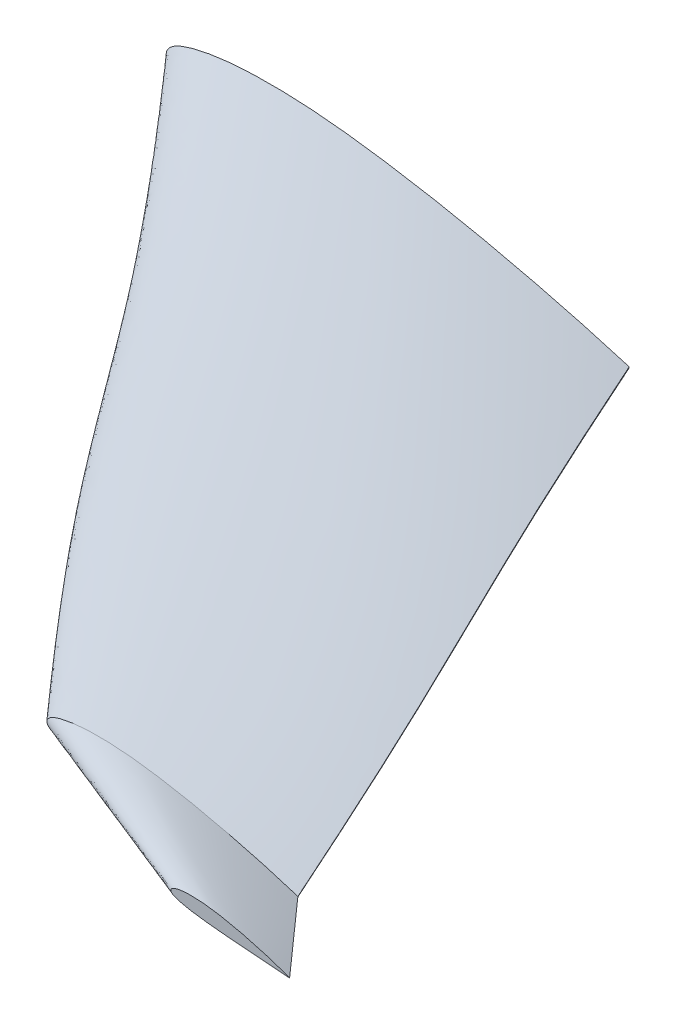
ISO-10303-21;
HEADER;
FILE_DESCRIPTION(('STEP AP214'),'2;1');
FILE_NAME('part.step','',(''),(''),'','','');
FILE_SCHEMA(('AUTOMOTIVE_DESIGN { 1 0 10303 214 1 1 1 1 }'));
ENDSEC;
DATA;
#1=APPLICATION_CONTEXT('core data for automotive mechanical design processes');
#2=APPLICATION_PROTOCOL_DEFINITION('international standard','automotive_design',2000,#1);
#3=PRODUCT_CONTEXT('',#1,'mechanical');
#4=PRODUCT('Part','Part','',(#3));
#5=PRODUCT_RELATED_PRODUCT_CATEGORY('part','',(#4));
#6=PRODUCT_DEFINITION_FORMATION('','',#4);
#7=PRODUCT_DEFINITION_CONTEXT('part definition',#1,'design');
#8=PRODUCT_DEFINITION('design','',#6,#7);
#9=PRODUCT_DEFINITION_SHAPE('','',#8);
#10=(LENGTH_UNIT() NAMED_UNIT(*) SI_UNIT(.MILLI.,.METRE.));
#11=(NAMED_UNIT(*) PLANE_ANGLE_UNIT() SI_UNIT($,.RADIAN.));
#12=(NAMED_UNIT(*) SI_UNIT($,.STERADIAN.) SOLID_ANGLE_UNIT());
#13=UNCERTAINTY_MEASURE_WITH_UNIT(LENGTH_MEASURE(1.E-05),#10,'distance_accuracy_value','');
#14=(GEOMETRIC_REPRESENTATION_CONTEXT(3) GLOBAL_UNCERTAINTY_ASSIGNED_CONTEXT((#13)) GLOBAL_UNIT_ASSIGNED_CONTEXT((#10,
#11,#12)) REPRESENTATION_CONTEXT('',''));
#15=CARTESIAN_POINT('',(0.,0.,0.));
#16=DIRECTION('',(0.,0.,1.));
#17=DIRECTION('',(1.,0.,0.));
#18=AXIS2_PLACEMENT_3D('',#15,#16,#17);
#19=CARTESIAN_POINT('',(0.321211549588751,1.38513605000242,0.));
#20=DIRECTION('',(0.,0.,-1.));
#21=DIRECTION('',(-1.,0.,0.));
#22=AXIS2_PLACEMENT_3D('',#19,#20,#21);
#23=PLANE('',#22);
#24=CARTESIAN_POINT('',(213.493162135836,-18.3985977387796,0.));
#25=CARTESIAN_POINT('',(210.001068508854,-17.358861418454,0.));
#26=CARTESIAN_POINT('',(203.02605295468,-15.2821195606542,0.));
#27=CARTESIAN_POINT('',(189.042387614006,-11.3725974573167,0.));
#28=CARTESIAN_POINT('',(171.520112606889,-6.86338505017849,0.));
#29=CARTESIAN_POINT('',(150.436618758431,-1.93851155160731,0.));
#30=CARTESIAN_POINT('',(129.312241209844,2.47849407440199,0.));
#31=CARTESIAN_POINT('',(108.118882190536,6.21363198308793,0.));
#32=CARTESIAN_POINT('',(86.8776689668776,9.34577660300751,0.));
#33=CARTESIAN_POINT('',(69.0819293463606,11.1183147996094,0.));
#34=CARTESIAN_POINT('',(54.792834861414,11.7745190823262,0.));
#35=CARTESIAN_POINT('',(44.03039723417,11.8458319915289,0.));
#36=CARTESIAN_POINT('',(33.2103727065102,11.4143190106629,0.));
#37=CARTESIAN_POINT('',(24.1576584095502,10.5092531024174,0.));
#38=CARTESIAN_POINT('',(16.891423222456,9.22497315586533,0.));
#39=CARTESIAN_POINT('',(11.3574177018554,7.96357807401569,0.));
#40=CARTESIAN_POINT('',(6.62056207418062,6.34416223062721,0.));
#41=CARTESIAN_POINT('',(2.47282370966279,4.24123989482026,0.));
#42=CARTESIAN_POINT('',(-1.32769035633093,0.309486082961757,0.));
#43=CARTESIAN_POINT('',(1.91001593785473,-3.72198031480986,0.));
#44=CARTESIAN_POINT('',(5.62165750212701,-5.75622948092245,0.));
#45=CARTESIAN_POINT('',(10.0491176639823,-7.44214581087602,0.));
#46=CARTESIAN_POINT('',(15.333006580463,-8.83549991642789,0.));
#47=CARTESIAN_POINT('',(22.3919662078617,-10.2476466023041,0.));
#48=CARTESIAN_POINT('',(31.2362759816886,-11.6329919054533,0.));
#49=CARTESIAN_POINT('',(41.8984815437594,-12.8110098179998,0.));
#50=CARTESIAN_POINT('',(52.5773178664621,-13.7111180719413,0.));
#51=CARTESIAN_POINT('',(66.8373810143671,-14.6421455738428,0.));
#52=CARTESIAN_POINT('',(84.6792224792707,-15.6334614652177,0.));
#53=CARTESIAN_POINT('',(106.113515108805,-16.517367698461,0.));
#54=CARTESIAN_POINT('',(127.567417979444,-17.1058304516163,0.));
#55=CARTESIAN_POINT('',(149.029350711165,-17.6442027773364,0.));
#56=CARTESIAN_POINT('',(170.496353699842,-18.1666577508834,0.));
#57=CARTESIAN_POINT('',(188.389987423759,-18.4835869038475,0.));
#58=CARTESIAN_POINT('',(202.706172144939,-18.7730528543508,0.));
#59=CARTESIAN_POINT('',(209.864963016244,-18.893426097058,0.));
#60=CARTESIAN_POINT('',(213.44460425543,-18.9536168515354,0.));
#61=B_SPLINE_CURVE_WITH_KNOTS('',3,(#24,#25,#26,#27,#28,#29,#30,#31,#32,#33,#34,#35,#36,#37,#38,
#39,#40,#41,#42,#43,#44,#45,#46,#47,#48,#49,#50,#51,#52,#53,#54,#55,#56,#57,#58,#59,#60),
.UNSPECIFIED.,.F.,.F.,(4,1,1,1,1,1,1,1,1,1,1,1,1,1,1,1,1,1,1,1,1,1,1,1,1,1,1,1,1,1,1,1,1,1,4),
(0.,0.025012489715977,0.0499592861627542,0.099672924927269,0.149206319906898,0.198581096612684,
0.247805170454698,0.296916574600785,0.34595272179258,0.370491625538827,0.395091203652992,
0.419814795797951,0.444798575013021,0.457489818920825,0.470406405401129,0.483879408645107,
0.491264120307465,0.50345885330176,0.513609129421187,0.520450990712491,0.533235387638849,
0.545691039129915,0.558031884238607,0.582609167277875,0.607134741746887,0.631652079865866,
0.656174271858889,0.705233949249511,0.754320378529551,0.803437363556193,0.852566095729207,
0.901700994035278,0.950848809338238,0.975422717018713,1.),.UNSPECIFIED.);
#62=CARTESIAN_POINT('',(213.493162135836,-18.3985977387796,0.));
#63=VERTEX_POINT('',#62);
#64=CARTESIAN_POINT('',(213.44460425543,-18.9536168515354,0.));
#65=VERTEX_POINT('',#64);
#66=EDGE_CURVE('E168',#63,#65,#61,.T.);
#67=ORIENTED_EDGE('',*,*,#66,.F.);
#68=DIRECTION('',(0.0871557427475811,0.996194698091752,0.));
#69=VECTOR('',#68,1.);
#70=CARTESIAN_POINT('',(213.493162135836,-18.3985977387796,0.));
#71=LINE('',#70,#69);
#72=EDGE_CURVE('E263',#65,#63,#71,.T.);
#73=ORIENTED_EDGE('',*,*,#72,.F.);
#74=EDGE_LOOP('',(#67,#73));
#75=FACE_BOUND('',#74,.T.);
#76=ADVANCED_FACE('F125',(#75),#23,.T.);
#77=CARTESIAN_POINT('',(213.44460425543,-18.9536168515354,0.));
#78=CARTESIAN_POINT('',(226.862538678686,-19.0972910790039,30.0953693301253));
#79=CARTESIAN_POINT('',(253.162471406783,-20.534168492408,89.5061121705992));
#80=CARTESIAN_POINT('',(295.313473355324,-27.2659662416428,180.74851220358));
#81=CARTESIAN_POINT('',(319.388843848483,-32.8681303766978,240.262627730834));
#82=CARTESIAN_POINT('',(331.160791957332,-36.1551964651623,270.51));
#83=CARTESIAN_POINT('',(213.460790215565,-18.7686104806168,0.));
#84=CARTESIAN_POINT('',(226.876481300607,-18.9233006079934,30.095706429741));
#85=CARTESIAN_POINT('',(253.172638473389,-20.3807560844573,89.506010616325));
#86=CARTESIAN_POINT('',(295.322337157831,-27.1296901721029,180.748369071528));
#87=CARTESIAN_POINT('',(319.398695934074,-32.7549400886849,240.263031574274));
#88=CARTESIAN_POINT('',(331.171339551054,-36.0548428143675,270.51));
#89=CARTESIAN_POINT('',(213.476976175701,-18.5836041096982,0.));
#90=CARTESIAN_POINT('',(226.890423922529,-18.7493101369828,30.0960435293568));
#91=CARTESIAN_POINT('',(253.182805539996,-20.2273436765067,89.5059090620509));
#92=CARTESIAN_POINT('',(295.331200960339,-26.9934141025631,180.748225939476));
#93=CARTESIAN_POINT('',(319.408548019666,-32.6417498006719,240.263435417714));
#94=CARTESIAN_POINT('',(331.181887144777,-35.9544891635727,270.51));
#95=CARTESIAN_POINT('',(213.493162135836,-18.3985977387796,0.));
#96=CARTESIAN_POINT('',(226.90436654445,-18.5753196659723,30.0963806289726));
#97=CARTESIAN_POINT('',(253.192972606603,-20.0739312685561,89.5058075077768));
#98=CARTESIAN_POINT('',(295.340064762847,-26.8571380330232,180.748082807424));
#99=CARTESIAN_POINT('',(319.418400105257,-32.528559512659,240.263839261154));
#100=CARTESIAN_POINT('',(331.1924347385,-35.8541355127779,270.51));
#101=B_SPLINE_SURFACE_WITH_KNOTS('',3,3,((#77,#78,#79,#80,#81,#82),(#83,#84,#85,#86,#87,#88),
(#89,#90,#91,#92,#93,#94),(#95,#96,#97,#98,#99,#100)),.UNSPECIFIED.,.F.,.F.,.F.,(4,4),(4,1,1,4),
(0.,1.),(0.,0.335136084150019,0.666898104022057,1.),.UNSPECIFIED.);
#102=CARTESIAN_POINT('',(213.493162135836,-18.3985977387796,0.));
#103=CARTESIAN_POINT('',(226.90436654445,-18.5753196659723,30.0963806289726));
#104=CARTESIAN_POINT('',(253.192972606603,-20.0739312685561,89.5058075077768));
#105=CARTESIAN_POINT('',(295.340064762847,-26.8571380330232,180.748082807424));
#106=CARTESIAN_POINT('',(319.418400105257,-32.528559512659,240.263839261154));
#107=CARTESIAN_POINT('',(331.1924347385,-35.8541355127779,270.51));
#108=B_SPLINE_CURVE_WITH_KNOTS('',3,(#102,#103,#104,#105,#106,#107),.UNSPECIFIED.,.F.,.F.,(4,1,
1,4),(0.,0.335136084150019,0.666898104022057,1.),.UNSPECIFIED.);
#109=CARTESIAN_POINT('',(331.1924347385,-35.8541355127779,270.51));
#110=VERTEX_POINT('',#109);
#111=EDGE_CURVE('E266',#63,#110,#108,.T.);
#112=DIRECTION('',(0.104528463267411,0.994521895368299,0.));
#113=VECTOR('',#112,1.);
#114=CARTESIAN_POINT('',(331.176613347916,-36.0046659889702,270.51));
#115=LINE('',#114,#113);
#116=CARTESIAN_POINT('',(331.160791957332,-36.1551964651623,270.51));
#117=VERTEX_POINT('',#116);
#118=EDGE_CURVE('E12',#117,#110,#115,.T.);
#119=CARTESIAN_POINT('',(213.44460425543,-18.9536168515354,0.));
#120=CARTESIAN_POINT('',(226.862538678686,-19.0972910790039,30.0953693301253));
#121=CARTESIAN_POINT('',(253.162471406783,-20.534168492408,89.5061121705992));
#122=CARTESIAN_POINT('',(295.313473355324,-27.2659662416428,180.74851220358));
#123=CARTESIAN_POINT('',(319.388843848483,-32.8681303766978,240.262627730834));
#124=CARTESIAN_POINT('',(331.160791957332,-36.1551964651623,270.51));
#125=B_SPLINE_CURVE_WITH_KNOTS('',3,(#119,#120,#121,#122,#123,#124),.UNSPECIFIED.,.F.,.F.,(4,1,
1,4),(0.,0.335136084150019,0.666898104022057,1.),.UNSPECIFIED.);
#126=EDGE_CURVE('E267',#117,#65,#125,.F.);
#127=ORIENTED_EDGE('',*,*,#72,.T.);
#128=ORIENTED_EDGE('',*,*,#111,.T.);
#129=ORIENTED_EDGE('',*,*,#118,.F.);
#130=ORIENTED_EDGE('',*,*,#126,.T.);
#131=EDGE_LOOP('',(#127,#128,#129,#130));
#132=FACE_BOUND('',#131,.T.);
#133=ADVANCED_FACE('F246',(#132),#101,.T.);
#134=CARTESIAN_POINT('',(213.493162135836,-18.3985977387796,0.));
#135=CARTESIAN_POINT('',(226.90436654445,-18.5753196659723,30.0963806289726));
#136=CARTESIAN_POINT('',(253.192972606603,-20.0739312685561,89.5058075077768));
#137=CARTESIAN_POINT('',(295.340064762847,-26.8571380330232,180.748082807424));
#138=CARTESIAN_POINT('',(319.418400105257,-32.528559512659,240.263839261154));
#139=CARTESIAN_POINT('',(331.1924347385,-35.8541355127779,270.51));
#140=CARTESIAN_POINT('',(210.001068508854,-17.358861418454,0.));
#141=CARTESIAN_POINT('',(223.610852826993,-17.6245419807283,30.0889257374059));
#142=CARTESIAN_POINT('',(250.286903716544,-19.273736759654,89.5107908183956));
#143=CARTESIAN_POINT('',(292.753431589681,-26.1484374132369,180.741753968393));
#144=CARTESIAN_POINT('',(317.285406265482,-31.8975890880902,240.275346209023));
#145=CARTESIAN_POINT('',(329.30516857852,-35.2561706694664,270.51));
#146=CARTESIAN_POINT('',(203.02605295468,-15.2821195606542,0.));
#147=CARTESIAN_POINT('',(217.032475537895,-15.7254837504745,30.0740355339388));
#148=CARTESIAN_POINT('',(244.482398489927,-17.6754493876229,89.5207443513734));
#149=CARTESIAN_POINT('',(287.586958824928,-24.7328975181817,180.72911291251));
#150=CARTESIAN_POINT('',(313.02502072071,-30.6373054314367,240.298329882699));
#151=CARTESIAN_POINT('',(325.535593009578,-34.0618114888534,270.51));
#152=CARTESIAN_POINT('',(189.042387614006,-11.3725974573167,0.));
#153=CARTESIAN_POINT('',(203.843352301703,-12.1563403654178,30.0412733162642));
#154=CARTESIAN_POINT('',(232.851442311001,-14.6817435408762,89.5424758077348));
#155=CARTESIAN_POINT('',(277.231195853682,-22.0812953998621,180.701884954814));
#156=CARTESIAN_POINT('',(304.48755508887,-28.2667647791892,240.347639251691));
#157=CARTESIAN_POINT('',(317.975856220827,-31.8053095298486,270.51));
#158=CARTESIAN_POINT('',(171.520112606889,-6.86338505017849,0.));
#159=CARTESIAN_POINT('',(187.315885151254,-8.04938907438476,29.9964292311644));
#160=CARTESIAN_POINT('',(218.286367956484,-11.2534690927014,89.5719925638465));
#161=CARTESIAN_POINT('',(264.258290634244,-19.0445908576241,180.665409228949));
#162=CARTESIAN_POINT('',(293.795187663331,-25.535667060746,240.413425140533));
#163=CARTESIAN_POINT('',(308.499410002367,-29.1894623997146,270.51));
#164=CARTESIAN_POINT('',(150.436618758431,-1.93851155160731,0.));
#165=CARTESIAN_POINT('',(167.426741714797,-3.57703316448807,29.9370577271212));
#166=CARTESIAN_POINT('',(200.773904138899,-7.54376983909616,89.6108273789968));
#167=CARTESIAN_POINT('',(248.65182626925,-15.7580099742789,180.617963337277));
#168=CARTESIAN_POINT('',(280.939245818828,-22.5573447823741,240.498700842052));
#169=CARTESIAN_POINT('',(297.09222653091,-26.3140319856753,270.51));
#170=CARTESIAN_POINT('',(129.312241209844,2.47849407440199,0.));
#171=CARTESIAN_POINT('',(147.496532970222,0.41899755165225,29.8730518667535));
#172=CARTESIAN_POINT('',(183.240548035301,-4.25590537220973,89.6524687463962));
#173=CARTESIAN_POINT('',(233.01848987033,-12.8447144011649,180.567593535598));
#174=CARTESIAN_POINT('',(268.067773789044,-19.8910023396196,240.588954741896));
#175=CARTESIAN_POINT('',(285.658016498096,-23.7141197663109,270.51));
#176=CARTESIAN_POINT('',(108.118882190536,6.21363198308793,0.));
#177=CARTESIAN_POINT('',(127.499961607454,3.77479288246094,29.8048636066008));
#178=CARTESIAN_POINT('',(165.666111803736,-1.53425018937368,89.6965374058752));
#179=CARTESIAN_POINT('',(217.340496132703,-10.4332867444915,180.5149510689));
#180=CARTESIAN_POINT('',(255.16357013174,-17.6427149754222,240.682913264853));
#181=CARTESIAN_POINT('',(274.179865434462,-21.4839869966944,270.51));
#182=CARTESIAN_POINT('',(86.8776689668776,9.34577660300751,0.));
#183=CARTESIAN_POINT('',(107.456423159288,6.5644797315658,29.7333725205199));
#184=CARTESIAN_POINT('',(148.066643745114,0.686960973240248,89.7425244306638));
#185=CARTESIAN_POINT('',(201.63217877431,-8.46556446903327,180.460508540359));
#186=CARTESIAN_POINT('',(242.239355434251,-15.763898360398,240.779808824563));
#187=CARTESIAN_POINT('',(262.669998946524,-19.5809844524857,270.51));
#188=CARTESIAN_POINT('',(69.0819293463606,11.1183147996094,0.));
#189=CARTESIAN_POINT('',(90.6650357634075,8.10177374930704,29.6710613804901));
#190=CARTESIAN_POINT('',(133.340005045048,1.84287812201813,89.7822747976374));
#191=CARTESIAN_POINT('',(188.481911775339,-7.44312443869545,180.414206904946));
#192=CARTESIAN_POINT('',(231.418821039981,-14.7105296043571,240.861786541589));
#193=CARTESIAN_POINT('',(253.019038449246,-18.4492782966341,270.51));
#194=CARTESIAN_POINT('',(54.792834861414,11.7745190823262,0.));
#195=CARTESIAN_POINT('',(77.1847916182926,8.61511699698462,29.6196579795138));
#196=CARTESIAN_POINT('',(121.530479573383,2.13628511524311,89.814772874926));
#197=CARTESIAN_POINT('',(177.933302359554,-7.18645320850219,180.37702973754));
#198=CARTESIAN_POINT('',(222.734568864501,-14.3332116054558,240.927219744428));
#199=CARTESIAN_POINT('',(245.262523058367,-17.9572876188291,270.51));
#200=CARTESIAN_POINT('',(44.03039723417,11.8458319915289,0.));
#201=CARTESIAN_POINT('',(67.0330584923573,8.60410768877151,29.580292144824));
#202=CARTESIAN_POINT('',(112.643925247689,2.00735996551949,89.8395070712488));
#203=CARTESIAN_POINT('',(169.99404906455,-7.30433499479855,180.349091150504));
#204=CARTESIAN_POINT('',(216.195650564881,-14.3072167318631,240.976183625478));
#205=CARTESIAN_POINT('',(239.416363910804,-17.8164890543781,270.51));
#206=CARTESIAN_POINT('',(33.2103727065102,11.4143190106629,0.));
#207=CARTESIAN_POINT('',(56.829048968141,8.11979566661484,29.5400574155923));
#208=CARTESIAN_POINT('',(103.719498942365,1.46148172678184,89.8646082006777));
#209=CARTESIAN_POINT('',(162.01955149694,-7.79318448503557,180.321156736593));
#210=CARTESIAN_POINT('',(209.6236765007,-14.588176112923,241.024891781575));
#211=CARTESIAN_POINT('',(233.534151780844,-17.9483111701696,270.51));
#212=CARTESIAN_POINT('',(24.1576584095502,10.5092531024174,0.));
#213=CARTESIAN_POINT('',(48.2942958766438,7.2028411541841,29.5057794896708));
#214=CARTESIAN_POINT('',(96.262985915454,0.554790632029118,89.8857996175519));
#215=CARTESIAN_POINT('',(155.355712172774,-8.60262525325472,180.298029008797));
#216=CARTESIAN_POINT('',(204.126684148115,-15.1551672601929,241.064944273909));
#217=CARTESIAN_POINT('',(228.607563554266,-18.354155984458,270.51));
#218=CARTESIAN_POINT('',(16.891423222456,9.22497315586533,0.));
#219=CARTESIAN_POINT('',(41.4469382677523,5.94202937962232,29.4777023300717));
#220=CARTESIAN_POINT('',(90.2881035191554,-0.634302074963703,89.9029529414575));
#221=CARTESIAN_POINT('',(150.015683037141,-9.66294446531732,180.279794733232));
#222=CARTESIAN_POINT('',(199.71528622706,-15.9505658378252,241.096223601941));
#223=CARTESIAN_POINT('',(224.647907562784,-18.9829544311337,270.51));
#224=CARTESIAN_POINT('',(11.3574177018554,7.96357807401569,0.));
#225=CARTESIAN_POINT('',(36.2335367533891,4.71524546030791,29.4560334654936));
#226=CARTESIAN_POINT('',(85.7427564382655,-1.77418488115485,89.91609239617));
#227=CARTESIAN_POINT('',(145.953131721756,-10.6790284591987,180.266064945198));
#228=CARTESIAN_POINT('',(196.355953156392,-16.7291359420679,241.119626012165));
#229=CARTESIAN_POINT('',(221.629525065256,-19.6157465769601,270.51));
#230=CARTESIAN_POINT('',(6.62056207418062,6.34416223062721,0.));
#231=CARTESIAN_POINT('',(31.7744803722957,3.15734230621254,29.4369565691629));
#232=CARTESIAN_POINT('',(81.8617361794341,-3.1962077108096,89.9274608738662));
#233=CARTESIAN_POINT('',(142.484535329774,-11.9460449755459,180.254668601984));
#234=CARTESIAN_POINT('',(193.480773903813,-17.7248154995599,241.138741322423));
#235=CARTESIAN_POINT('',(219.040809700408,-20.4505973244493,270.51));
#236=CARTESIAN_POINT('',(2.47282370966279,4.24123989482026,0.));
#237=CARTESIAN_POINT('',(27.874495459809,1.14876589703227,29.4195753624093));
#238=CARTESIAN_POINT('',(78.4754189597392,-5.00779761358148,89.937562706039));
#239=CARTESIAN_POINT('',(139.458619666965,-13.5596260317908,180.245173584661));
#240=CARTESIAN_POINT('',(190.963184305249,-19.0145597172881,241.154245225989));
#241=CARTESIAN_POINT('',(216.767555071202,-21.5537057330466,270.51));
#242=CARTESIAN_POINT('',(-1.32769035633093,0.309486082961757,0.));
#243=CARTESIAN_POINT('',(24.3145031410197,-2.57808233823712,29.4016438225585));
#244=CARTESIAN_POINT('',(75.4075673241917,-8.32574874226183,89.9472586235873));
#245=CARTESIAN_POINT('',(136.71935356865,-16.5138474425661,180.237895059686));
#246=CARTESIAN_POINT('',(188.655875953834,-21.4196292274765,241.164821465056));
#247=CARTESIAN_POINT('',(214.665592348551,-23.6536434467919,270.51));
#248=CARTESIAN_POINT('',(1.91001593785473,-3.72198031480986,0.));
#249=CARTESIAN_POINT('',(27.3978079518463,-6.34747152974142,29.4093895932417));
#250=CARTESIAN_POINT('',(78.1494119311785,-11.6035115395859,89.9406143693721));
#251=CARTESIAN_POINT('',(139.176262898494,-19.4295437388056,180.249557029994));
#252=CARTESIAN_POINT('',(190.618758534834,-23.8751093810544,241.141916625741));
#253=CARTESIAN_POINT('',(216.386289596125,-25.8744926130322,270.51));
#254=CARTESIAN_POINT('',(5.62165750212701,-5.75622948092245,0.));
#255=CARTESIAN_POINT('',(30.9146324857611,-8.23418356472542,29.4208927143013));
#256=CARTESIAN_POINT('',(81.2477123802077,-13.2213297773066,89.9324248411367));
#257=CARTESIAN_POINT('',(141.949479746157,-20.8676467144497,180.26105719412));
#258=CARTESIAN_POINT('',(192.870145446625,-25.1112061297683,241.12042708406));
#259=CARTESIAN_POINT('',(218.38339739238,-27.0148215081227,270.51));
#260=CARTESIAN_POINT('',(10.0491176639823,-7.44214581087602,0.));
#261=CARTESIAN_POINT('',(35.1044639905956,-9.78785540062072,29.4353664739196));
#262=CARTESIAN_POINT('',(84.9307863098754,-14.5386442673172,89.9224928808187));
#263=CARTESIAN_POINT('',(145.245007179098,-22.0379437500139,180.274235369421));
#264=CARTESIAN_POINT('',(195.556286527383,-26.1337414987524,241.096168909065));
#265=CARTESIAN_POINT('',(220.772686162766,-27.972701909687,270.51));
#266=CARTESIAN_POINT('',(15.333006580463,-8.83549991642789,0.));
#267=CARTESIAN_POINT('',(40.1002175443759,-11.0598872759691,29.4532595431332));
#268=CARTESIAN_POINT('',(89.3157522879755,-15.5991541401455,89.9105096346987));
#269=CARTESIAN_POINT('',(149.167401434331,-22.9792285898745,180.28950344187));
#270=CARTESIAN_POINT('',(198.762749440642,-26.9765672034526,241.068382854478));
#271=CARTESIAN_POINT('',(223.630015363557,-28.7797652969144,270.51));
#272=CARTESIAN_POINT('',(22.3919662078617,-10.2476466023041,0.));
#273=CARTESIAN_POINT('',(46.7707609250187,-12.3364516340787,29.4776117209379));
#274=CARTESIAN_POINT('',(95.1662709241655,-16.6443900154296,89.8944126478682));
#275=CARTESIAN_POINT('',(154.399625529484,-23.9060299943752,180.309547713374));
#276=CARTESIAN_POINT('',(203.047206759127,-27.8283595042541,241.032149405377));
#277=CARTESIAN_POINT('',(227.451496803114,-29.6138704503555,270.51));
#278=CARTESIAN_POINT('',(31.2362759816886,-11.6329919054533,0.));
#279=CARTESIAN_POINT('',(55.124978038478,-13.5744889544146,29.5084499454577));
#280=CARTESIAN_POINT('',(102.490372296224,-17.6365106091244,89.8742101056708));
#281=CARTESIAN_POINT('',(160.948068496207,-24.7845970524823,180.334300211232));
#282=CARTESIAN_POINT('',(208.416707148622,-28.6613183198218,240.9876225345));
#283=CARTESIAN_POINT('',(232.24314727314,-30.4503453283669,270.51));
#284=CARTESIAN_POINT('',(41.8984815437594,-12.8110098179998,0.));
#285=CARTESIAN_POINT('',(65.1916496505545,-14.6038700541375,29.5460149251942));
#286=CARTESIAN_POINT('',(111.312242061127,-18.4256580530978,89.8498475728534));
#287=CARTESIAN_POINT('',(168.833144497602,-25.4815707977918,180.363596023885));
#288=CARTESIAN_POINT('',(214.89213577574,-29.3651556693795,240.9352255971));
#289=CARTESIAN_POINT('',(238.024359493074,-31.1914254299729,270.51));
#290=CARTESIAN_POINT('',(52.5773178664621,-13.7111180719413,0.));
#291=CARTESIAN_POINT('',(75.2707204259448,-15.3715239325666,29.5837520427745));
#292=CARTESIAN_POINT('',(120.143936795451,-18.984729816028,89.8255298359253));
#293=CARTESIAN_POINT('',(176.724670056452,-25.9737416344551,180.392483527385));
#294=CARTESIAN_POINT('',(221.379906956311,-29.8993201162571,240.883756498485));
#295=CARTESIAN_POINT('',(243.817241923785,-31.7816851692663,270.51));
#296=CARTESIAN_POINT('',(66.8373810143671,-14.6421455738428,0.));
#297=CARTESIAN_POINT('',(88.7261271860967,-16.1415541609596,29.6341229971317));
#298=CARTESIAN_POINT('',(131.933963232243,-19.5072706674564,89.7932422099169));
#299=CARTESIAN_POINT('',(187.256550115374,-26.4315762486696,180.430447915067));
#300=CARTESIAN_POINT('',(230.046407880194,-30.4471826121611,240.816335481284));
#301=CARTESIAN_POINT('',(251.555379595883,-32.422701869833,270.51));
#302=CARTESIAN_POINT('',(84.6792224792707,-15.6334614652177,0.));
#303=CARTESIAN_POINT('',(105.55635330747,-16.9413717280267,29.6965658501218));
#304=CARTESIAN_POINT('',(146.684778661257,-20.0176615104597,89.7533934543317));
#305=CARTESIAN_POINT('',(200.427797490357,-26.8766497374708,180.47689724223));
#306=CARTESIAN_POINT('',(240.895384043029,-31.0266727072264,240.734077234843));
#307=CARTESIAN_POINT('',(261.238793615968,-33.1304359325921,270.51));
#308=CARTESIAN_POINT('',(106.113515108805,-16.517367698461,0.));
#309=CARTESIAN_POINT('',(125.767185493773,-17.6129438676353,29.7702453127613));
#310=CARTESIAN_POINT('',(164.404351899109,-20.377088036694,89.7067144506551));
#311=CARTESIAN_POINT('',(216.240897992811,-27.1854020589829,180.530524038329));
#312=CARTESIAN_POINT('',(253.9380571495,-31.5353050468004,240.639559118436));
#313=CARTESIAN_POINT('',(272.874872377579,-33.8138844012274,270.51));
#314=CARTESIAN_POINT('',(127.567417979444,-17.1058304516163,0.));
#315=CARTESIAN_POINT('',(145.988257107223,-18.0060545558634,29.8421543453142));
#316=CARTESIAN_POINT('',(182.13909958003,-20.4919609045208,89.6615461213576));
#317=CARTESIAN_POINT('',(232.058400461732,-27.2764558952013,180.58151298313));
#318=CARTESIAN_POINT('',(267.002020265535,-31.8633761492902,240.550216683599));
#319=CARTESIAN_POINT('',(284.524406259651,-34.337015282579,270.51));
#320=CARTESIAN_POINT('',(149.029350711165,-17.6442027773364,0.));
#321=CARTESIAN_POINT('',(166.210204326874,-18.3515241125298,29.9113466015518));
#322=CARTESIAN_POINT('',(199.883794108276,-20.565480309295,89.6184022526645));
#323=CARTESIAN_POINT('',(247.875802046587,-27.330444737563,180.629472737578));
#324=CARTESIAN_POINT('',(280.080241308474,-32.1608891212505,240.466623620057));
#325=CARTESIAN_POINT('',(296.178777461208,-34.8330100270177,270.51));
#326=CARTESIAN_POINT('',(170.496353699842,-18.1666577508834,0.));
#327=CARTESIAN_POINT('',(186.430458146682,-18.6814900915562,29.9771662525519));
#328=CARTESIAN_POINT('',(217.636576880973,-20.6259966818599,89.57770975342));
#329=CARTESIAN_POINT('',(263.691539249276,-27.3724933309515,180.673886377347));
#330=CARTESIAN_POINT('',(293.170801615898,-32.4488520831591,240.389706460419));
#331=CARTESIAN_POINT('',(307.836054085713,-35.3204055408287,270.51));
#332=CARTESIAN_POINT('',(188.389987423759,-18.4835869038475,0.));
#333=CARTESIAN_POINT('',(203.278687446773,-18.8446736410981,30.0287522621906));
#334=CARTESIAN_POINT('',(232.435692083937,-20.5785445417731,89.5462236795797));
#335=CARTESIAN_POINT('',(276.868396085882,-27.3201936472241,180.707285336023));
#336=CARTESIAN_POINT('',(304.089953940662,-32.6166317908149,240.332458364911));
#337=CARTESIAN_POINT('',(317.553999932104,-35.6622612937278,270.51));
#338=CARTESIAN_POINT('',(202.706172144939,-18.7730528543508,0.));
#339=CARTESIAN_POINT('',(216.75573425345,-19.0087418999768,30.0677194613096));
#340=CARTESIAN_POINT('',(244.278602213616,-20.5704262371126,89.5226496946751));
#341=CARTESIAN_POINT('',(287.409090452033,-27.3046231207238,180.731785795453));
#342=CARTESIAN_POINT('',(312.830213832267,-32.7730226317738,240.290782450419));
#343=CARTESIAN_POINT('',(325.328710116088,-35.9552734513258,270.51));
#344=CARTESIAN_POINT('',(209.864963016244,-18.893426097058,0.));
#345=CARTESIAN_POINT('',(223.493449639923,-19.0677733347299,30.0861522852483));
#346=CARTESIAN_POINT('',(250.20104610743,-20.5462549606046,89.5116249309879));
#347=CARTESIAN_POINT('',(292.67855843294,-27.2788524579091,180.742936478958));
#348=CARTESIAN_POINT('',(317.202533758049,-32.8364263437074,240.272013067005));
#349=CARTESIAN_POINT('',(329.216675679051,-36.0885524097148,270.51));
#350=CARTESIAN_POINT('',(213.44460425543,-18.9536168515354,0.));
#351=CARTESIAN_POINT('',(226.862538678686,-19.0972910790039,30.0953693301253));
#352=CARTESIAN_POINT('',(253.162471406782,-20.534168492408,89.5061121705992));
#353=CARTESIAN_POINT('',(295.313473355324,-27.2659662416428,180.74851220358));
#354=CARTESIAN_POINT('',(319.388843848483,-32.8681303766978,240.262627730835));
#355=CARTESIAN_POINT('',(331.160791957332,-36.1551964651623,270.51));
#356=B_SPLINE_SURFACE_WITH_KNOTS('',3,3,((#134,#135,#136,#137,#138,#139),(#140,#141,#142,#143,
#144,#145),(#146,#147,#148,#149,#150,#151),(#152,#153,#154,#155,#156,#157),(#158,#159,#160,#161,
#162,#163),(#164,#165,#166,#167,#168,#169),(#170,#171,#172,#173,#174,#175),(#176,#177,#178,#179,
#180,#181),(#182,#183,#184,#185,#186,#187),(#188,#189,#190,#191,#192,#193),(#194,#195,#196,#197,
#198,#199),(#200,#201,#202,#203,#204,#205),(#206,#207,#208,#209,#210,#211),(#212,#213,#214,#215,
#216,#217),(#218,#219,#220,#221,#222,#223),(#224,#225,#226,#227,#228,#229),(#230,#231,#232,#233,
#234,#235),(#236,#237,#238,#239,#240,#241),(#242,#243,#244,#245,#246,#247),(#248,#249,#250,#251,
#252,#253),(#254,#255,#256,#257,#258,#259),(#260,#261,#262,#263,#264,#265),(#266,#267,#268,#269,
#270,#271),(#272,#273,#274,#275,#276,#277),(#278,#279,#280,#281,#282,#283),(#284,#285,#286,#287,
#288,#289),(#290,#291,#292,#293,#294,#295),(#296,#297,#298,#299,#300,#301),(#302,#303,#304,#305,
#306,#307),(#308,#309,#310,#311,#312,#313),(#314,#315,#316,#317,#318,#319),(#320,#321,#322,#323,
#324,#325),(#326,#327,#328,#329,#330,#331),(#332,#333,#334,#335,#336,#337),(#338,#339,#340,#341,
#342,#343),(#344,#345,#346,#347,#348,#349),(#350,#351,#352,#353,#354,#355)),.UNSPECIFIED.,.F.,
.F.,.F.,(4,1,1,1,1,1,1,1,1,1,1,1,1,1,1,1,1,1,1,1,1,1,1,1,1,1,1,1,1,1,1,1,1,1,4),(4,1,1,4),(0.,
0.025012489715977,0.0499592861627542,0.099672924927269,0.149206319906898,0.198581096612684,
0.247805170454698,0.296916574600785,0.34595272179258,0.370491625538827,0.395091203652992,
0.419814795797951,0.444798575013021,0.457489818920825,0.470406405401129,0.483879408645107,
0.491264120307465,0.50345885330176,0.513609129421187,0.520450990712491,0.533235387638849,
0.545691039129915,0.558031884238607,0.582609167277875,0.607134741746887,0.631652079865867,
0.656174271858889,0.705233949249511,0.754320378529552,0.803437363556193,0.852566095729207,
0.901700994035278,0.950848809338238,0.975422717018713,1.),(0.,0.335136084150019,
0.666898104022057,1.),.UNSPECIFIED.);
#357=CARTESIAN_POINT('',(331.1924347385,-35.8541355127779,270.51));
#358=CARTESIAN_POINT('',(329.30516857852,-35.2561706694664,270.51));
#359=CARTESIAN_POINT('',(325.535593009578,-34.0618114888534,270.51));
#360=CARTESIAN_POINT('',(317.975856220827,-31.8053095298486,270.51));
#361=CARTESIAN_POINT('',(308.499410002367,-29.1894623997146,270.51));
#362=CARTESIAN_POINT('',(297.09222653091,-26.3140319856753,270.51));
#363=CARTESIAN_POINT('',(285.658016498096,-23.7141197663109,270.51));
#364=CARTESIAN_POINT('',(274.179865434462,-21.4839869966944,270.51));
#365=CARTESIAN_POINT('',(262.669998946524,-19.5809844524857,270.51));
#366=CARTESIAN_POINT('',(253.019038449246,-18.4492782966341,270.51));
#367=CARTESIAN_POINT('',(245.262523058367,-17.9572876188291,270.51));
#368=CARTESIAN_POINT('',(239.416363910804,-17.8164890543781,270.51));
#369=CARTESIAN_POINT('',(233.534151780844,-17.9483111701696,270.51));
#370=CARTESIAN_POINT('',(228.607563554266,-18.354155984458,270.51));
#371=CARTESIAN_POINT('',(224.647907562784,-18.9829544311337,270.51));
#372=CARTESIAN_POINT('',(221.629525065256,-19.6157465769601,270.51));
#373=CARTESIAN_POINT('',(219.040809700408,-20.4505973244493,270.51));
#374=CARTESIAN_POINT('',(216.767555071202,-21.5537057330466,270.51));
#375=CARTESIAN_POINT('',(214.665592348551,-23.6536434467919,270.51));
#376=CARTESIAN_POINT('',(216.386289596125,-25.8744926130322,270.51));
#377=CARTESIAN_POINT('',(218.38339739238,-27.0148215081227,270.51));
#378=CARTESIAN_POINT('',(220.772686162766,-27.972701909687,270.51));
#379=CARTESIAN_POINT('',(223.630015363557,-28.7797652969144,270.51));
#380=CARTESIAN_POINT('',(227.451496803114,-29.6138704503555,270.51));
#381=CARTESIAN_POINT('',(232.24314727314,-30.4503453283669,270.51));
#382=CARTESIAN_POINT('',(238.024359493074,-31.1914254299729,270.51));
#383=CARTESIAN_POINT('',(243.817241923785,-31.7816851692663,270.51));
#384=CARTESIAN_POINT('',(251.555379595883,-32.422701869833,270.51));
#385=CARTESIAN_POINT('',(261.238793615968,-33.1304359325921,270.51));
#386=CARTESIAN_POINT('',(272.874872377579,-33.8138844012274,270.51));
#387=CARTESIAN_POINT('',(284.524406259651,-34.337015282579,270.51));
#388=CARTESIAN_POINT('',(296.178777461208,-34.8330100270177,270.51));
#389=CARTESIAN_POINT('',(307.836054085713,-35.3204055408287,270.51));
#390=CARTESIAN_POINT('',(317.553999932104,-35.6622612937278,270.51));
#391=CARTESIAN_POINT('',(325.328710116088,-35.9552734513258,270.51));
#392=CARTESIAN_POINT('',(329.216675679051,-36.0885524097148,270.51));
#393=CARTESIAN_POINT('',(331.160791957332,-36.1551964651623,270.51));
#394=B_SPLINE_CURVE_WITH_KNOTS('',3,(#357,#358,#359,#360,#361,#362,#363,#364,#365,#366,#367,
#368,#369,#370,#371,#372,#373,#374,#375,#376,#377,#378,#379,#380,#381,#382,#383,#384,#385,#386,
#387,#388,#389,#390,#391,#392,#393),.UNSPECIFIED.,.F.,.F.,(4,1,1,1,1,1,1,1,1,1,1,1,1,1,1,1,1,1,
1,1,1,1,1,1,1,1,1,1,1,1,1,1,1,1,4),(0.,0.025012489715977,0.0499592861627542,0.099672924927269,
0.149206319906898,0.198581096612684,0.247805170454698,0.296916574600785,0.34595272179258,
0.370491625538827,0.395091203652992,0.419814795797951,0.444798575013021,0.457489818920825,
0.470406405401129,0.483879408645107,0.491264120307465,0.50345885330176,0.513609129421187,
0.520450990712491,0.533235387638849,0.545691039129915,0.558031884238607,0.582609167277875,
0.607134741746887,0.631652079865867,0.656174271858889,0.705233949249511,0.754320378529552,
0.803437363556193,0.852566095729207,0.901700994035278,0.950848809338238,0.975422717018713,1.),.UNSPECIFIED.);
#395=EDGE_CURVE('E131',#110,#117,#394,.T.);
#396=ORIENTED_EDGE('',*,*,#66,.T.);
#397=ORIENTED_EDGE('',*,*,#126,.F.);
#398=ORIENTED_EDGE('',*,*,#395,.F.);
#399=ORIENTED_EDGE('',*,*,#111,.F.);
#400=EDGE_LOOP('',(#396,#397,#398,#399));
#401=FACE_BOUND('',#400,.T.);
#402=ADVANCED_FACE('F127',(#401),#356,.T.);
#403=CARTESIAN_POINT('',(309.485033406603,-25.4030900034203,307.34));
#404=DIRECTION('',(0.,0.,-1.));
#405=DIRECTION('',(-1.,0.,0.));
#406=AXIS2_PLACEMENT_3D('',#403,#404,#405);
#407=PLANE('',#406);
#408=CARTESIAN_POINT('',(364.214314227244,-33.3894044828556,307.34));
#409=CARTESIAN_POINT('',(363.327438205128,-33.0739443125982,307.34));
#410=CARTESIAN_POINT('',(361.556015468611,-32.4438525025544,307.34));
#411=CARTESIAN_POINT('',(358.001194054443,-31.2461543962738,307.34));
#412=CARTESIAN_POINT('',(353.541546045706,-29.8458957745613,307.34));
#413=CARTESIAN_POINT('',(348.168750218797,-28.2902491069044,307.34));
#414=CARTESIAN_POINT('',(342.778539914125,-26.8650757808226,307.34));
#415=CARTESIAN_POINT('',(337.361313496573,-25.6148865534841,307.34));
#416=CARTESIAN_POINT('',(331.923588089907,-24.5196180685861,307.34));
#417=CARTESIAN_POINT('',(327.356386182137,-23.8217035136053,307.34));
#418=CARTESIAN_POINT('',(323.678778815172,-23.4592074848949,307.34));
#419=CARTESIAN_POINT('',(320.9031144009,-23.2952923462694,307.34));
#420=CARTESIAN_POINT('',(318.105794379509,-23.2603239144481,307.34));
#421=CARTESIAN_POINT('',(315.758024391942,-23.3714240819501,307.34));
#422=CARTESIAN_POINT('',(313.8660254048,-23.6045132980271,307.34));
#423=CARTESIAN_POINT('',(312.421238171704,-23.8551195485022,307.34));
#424=CARTESIAN_POINT('',(311.177268931585,-24.2088706018302,307.34));
#425=CARTESIAN_POINT('',(310.078750148336,-24.6953280695575,307.34));
#426=CARTESIAN_POINT('',(309.04508534983,-25.6583051714147,307.34));
#427=CARTESIAN_POINT('',(309.825880705523,-26.7421698598226,307.34));
#428=CARTESIAN_POINT('',(310.755951832388,-27.3171753927876,307.34));
#429=CARTESIAN_POINT('',(311.875408561842,-27.8119921041149,307.34));
#430=CARTESIAN_POINT('',(313.219773201302,-28.2429095596807,307.34));
#431=CARTESIAN_POINT('',(315.021838751617,-28.7026757654428,307.34));
#432=CARTESIAN_POINT('',(317.284873698056,-29.1796668054095,307.34));
#433=CARTESIAN_POINT('',(320.019715432381,-29.6277483598614,307.34));
#434=CARTESIAN_POINT('',(322.762605344278,-30.0043561569791,307.34));
#435=CARTESIAN_POINT('',(326.429007008643,-30.437361998764,307.34));
#436=CARTESIAN_POINT('',(331.018665611486,-30.93435036126,307.34));
#437=CARTESIAN_POINT('',(336.536602082341,-31.4522007047766,307.34));
#438=CARTESIAN_POINT('',(342.063592486078,-31.8940939808214,307.34));
#439=CARTESIAN_POINT('',(347.593331797532,-32.3231728705237,307.34));
#440=CARTESIAN_POINT('',(353.12459441305,-32.7482137561164,307.34));
#441=CARTESIAN_POINT('',(357.736733291437,-33.071915644452,307.34));
#442=CARTESIAN_POINT('',(361.426288338813,-33.3401622013209,307.34));
#443=CARTESIAN_POINT('',(363.27157543652,-33.4680102949107,307.34));
#444=CARTESIAN_POINT('',(364.194282344968,-33.531938731485,307.34));
#445=B_SPLINE_CURVE_WITH_KNOTS('',3,(#408,#409,#410,#411,#412,#413,#414,#415,#416,#417,#418,
#419,#420,#421,#422,#423,#424,#425,#426,#427,#428,#429,#430,#431,#432,#433,#434,#435,#436,#437,
#438,#439,#440,#441,#442,#443,#444),.UNSPECIFIED.,.F.,.F.,(4,1,1,1,1,1,1,1,1,1,1,1,1,1,1,1,1,1,
1,1,1,1,1,1,1,1,1,1,1,1,1,1,1,1,4),(0.,0.025012489715977,0.0499592861627542,0.099672924927269,
0.149206319906898,0.198581096612684,0.247805170454698,0.296916574600785,0.34595272179258,
0.370491625538827,0.395091203652992,0.419814795797951,0.444798575013021,0.457489818920825,
0.470406405401129,0.483879408645107,0.491264120307465,0.50345885330176,0.513609129421187,
0.520450990712491,0.533235387638849,0.545691039129915,0.558031884238607,0.582609167277875,
0.607134741746887,0.631652079865866,0.656174271858889,0.705233949249511,0.754320378529551,
0.803437363556193,0.852566095729207,0.901700994035278,0.950848809338238,0.975422717018713,1.),.UNSPECIFIED.);
#446=CARTESIAN_POINT('',(364.214314227244,-33.3894044828555,307.34));
#447=VERTEX_POINT('',#446);
#448=CARTESIAN_POINT('',(364.194282344968,-33.531938731485,307.34));
#449=VERTEX_POINT('',#448);
#450=EDGE_CURVE('E164',#447,#449,#445,.T.);
#451=ORIENTED_EDGE('',*,*,#450,.T.);
#452=DIRECTION('',(0.139173100961149,0.990268068741418,0.));
#453=VECTOR('',#452,1.);
#454=CARTESIAN_POINT('',(364.194282344968,-33.531938731485,307.34));
#455=LINE('',#454,#453);
#456=EDGE_CURVE('E171',#449,#447,#455,.T.);
#457=ORIENTED_EDGE('',*,*,#456,.T.);
#458=EDGE_LOOP('',(#451,#457));
#459=FACE_BOUND('',#458,.T.);
#460=ADVANCED_FACE('F180',(#459),#407,.F.);
#461=CARTESIAN_POINT('',(331.1924347385,-35.8541355127779,270.51));
#462=CARTESIAN_POINT('',(364.214314227244,-33.3894044828556,307.34));
#463=CARTESIAN_POINT('',(329.30516857852,-35.2561706694664,270.51));
#464=CARTESIAN_POINT('',(363.327438205128,-33.0739443125982,307.34));
#465=CARTESIAN_POINT('',(325.535593009578,-34.0618114888534,270.51));
#466=CARTESIAN_POINT('',(361.556015468611,-32.4438525025544,307.34));
#467=CARTESIAN_POINT('',(317.975856220827,-31.8053095298486,270.51));
#468=CARTESIAN_POINT('',(358.001194054443,-31.2461543962738,307.34));
#469=CARTESIAN_POINT('',(308.499410002367,-29.1894623997146,270.51));
#470=CARTESIAN_POINT('',(353.541546045706,-29.8458957745613,307.34));
#471=CARTESIAN_POINT('',(297.09222653091,-26.3140319856753,270.51));
#472=CARTESIAN_POINT('',(348.168750218797,-28.2902491069044,307.34));
#473=CARTESIAN_POINT('',(285.658016498096,-23.7141197663109,270.51));
#474=CARTESIAN_POINT('',(342.778539914125,-26.8650757808226,307.34));
#475=CARTESIAN_POINT('',(274.179865434462,-21.4839869966944,270.51));
#476=CARTESIAN_POINT('',(337.361313496573,-25.6148865534841,307.34));
#477=CARTESIAN_POINT('',(262.669998946524,-19.5809844524857,270.51));
#478=CARTESIAN_POINT('',(331.923588089907,-24.5196180685861,307.34));
#479=CARTESIAN_POINT('',(253.019038449246,-18.4492782966341,270.51));
#480=CARTESIAN_POINT('',(327.356386182137,-23.8217035136053,307.34));
#481=CARTESIAN_POINT('',(245.262523058367,-17.9572876188291,270.51));
#482=CARTESIAN_POINT('',(323.678778815172,-23.4592074848949,307.34));
#483=CARTESIAN_POINT('',(239.416363910804,-17.8164890543781,270.51));
#484=CARTESIAN_POINT('',(320.9031144009,-23.2952923462694,307.34));
#485=CARTESIAN_POINT('',(233.534151780844,-17.9483111701696,270.51));
#486=CARTESIAN_POINT('',(318.105794379509,-23.2603239144481,307.34));
#487=CARTESIAN_POINT('',(228.607563554266,-18.354155984458,270.51));
#488=CARTESIAN_POINT('',(315.758024391942,-23.3714240819501,307.34));
#489=CARTESIAN_POINT('',(224.647907562784,-18.9829544311337,270.51));
#490=CARTESIAN_POINT('',(313.8660254048,-23.6045132980271,307.34));
#491=CARTESIAN_POINT('',(221.629525065256,-19.6157465769601,270.51));
#492=CARTESIAN_POINT('',(312.421238171704,-23.8551195485022,307.34));
#493=CARTESIAN_POINT('',(219.040809700408,-20.4505973244493,270.51));
#494=CARTESIAN_POINT('',(311.177268931585,-24.2088706018302,307.34));
#495=CARTESIAN_POINT('',(216.767555071202,-21.5537057330466,270.51));
#496=CARTESIAN_POINT('',(310.078750148336,-24.6953280695575,307.34));
#497=CARTESIAN_POINT('',(214.665592348551,-23.6536434467919,270.51));
#498=CARTESIAN_POINT('',(309.04508534983,-25.6583051714147,307.34));
#499=CARTESIAN_POINT('',(216.386289596125,-25.8744926130322,270.51));
#500=CARTESIAN_POINT('',(309.825880705523,-26.7421698598226,307.34));
#501=CARTESIAN_POINT('',(218.38339739238,-27.0148215081227,270.51));
#502=CARTESIAN_POINT('',(310.755951832388,-27.3171753927876,307.34));
#503=CARTESIAN_POINT('',(220.772686162766,-27.972701909687,270.51));
#504=CARTESIAN_POINT('',(311.875408561842,-27.8119921041149,307.34));
#505=CARTESIAN_POINT('',(223.630015363557,-28.7797652969144,270.51));
#506=CARTESIAN_POINT('',(313.219773201302,-28.2429095596807,307.34));
#507=CARTESIAN_POINT('',(227.451496803114,-29.6138704503555,270.51));
#508=CARTESIAN_POINT('',(315.021838751617,-28.7026757654428,307.34));
#509=CARTESIAN_POINT('',(232.24314727314,-30.4503453283669,270.51));
#510=CARTESIAN_POINT('',(317.284873698056,-29.1796668054095,307.34));
#511=CARTESIAN_POINT('',(238.024359493074,-31.1914254299729,270.51));
#512=CARTESIAN_POINT('',(320.019715432381,-29.6277483598614,307.34));
#513=CARTESIAN_POINT('',(243.817241923785,-31.7816851692663,270.51));
#514=CARTESIAN_POINT('',(322.762605344278,-30.0043561569791,307.34));
#515=CARTESIAN_POINT('',(251.555379595883,-32.422701869833,270.51));
#516=CARTESIAN_POINT('',(326.429007008643,-30.437361998764,307.34));
#517=CARTESIAN_POINT('',(261.238793615968,-33.1304359325921,270.51));
#518=CARTESIAN_POINT('',(331.018665611486,-30.93435036126,307.34));
#519=CARTESIAN_POINT('',(272.874872377579,-33.8138844012274,270.51));
#520=CARTESIAN_POINT('',(336.536602082341,-31.4522007047766,307.34));
#521=CARTESIAN_POINT('',(284.524406259651,-34.337015282579,270.51));
#522=CARTESIAN_POINT('',(342.063592486078,-31.8940939808214,307.34));
#523=CARTESIAN_POINT('',(296.178777461208,-34.8330100270177,270.51));
#524=CARTESIAN_POINT('',(347.593331797532,-32.3231728705237,307.34));
#525=CARTESIAN_POINT('',(307.836054085713,-35.3204055408287,270.51));
#526=CARTESIAN_POINT('',(353.12459441305,-32.7482137561164,307.34));
#527=CARTESIAN_POINT('',(317.553999932104,-35.6622612937278,270.51));
#528=CARTESIAN_POINT('',(357.736733291437,-33.071915644452,307.34));
#529=CARTESIAN_POINT('',(325.328710116088,-35.9552734513258,270.51));
#530=CARTESIAN_POINT('',(361.426288338813,-33.3401622013209,307.34));
#531=CARTESIAN_POINT('',(329.216675679051,-36.0885524097148,270.51));
#532=CARTESIAN_POINT('',(363.27157543652,-33.4680102949107,307.34));
#533=CARTESIAN_POINT('',(331.160791957332,-36.1551964651623,270.51));
#534=CARTESIAN_POINT('',(364.194282344968,-33.531938731485,307.34));
#535=B_SPLINE_SURFACE_WITH_KNOTS('',3,1,((#461,#462),(#463,#464),(#465,#466),(#467,#468),(#469,
#470),(#471,#472),(#473,#474),(#475,#476),(#477,#478),(#479,#480),(#481,#482),(#483,#484),(#485,
#486),(#487,#488),(#489,#490),(#491,#492),(#493,#494),(#495,#496),(#497,#498),(#499,#500),(#501,
#502),(#503,#504),(#505,#506),(#507,#508),(#509,#510),(#511,#512),(#513,#514),(#515,#516),(#517,
#518),(#519,#520),(#521,#522),(#523,#524),(#525,#526),(#527,#528),(#529,#530),(#531,#532),(#533,
#534)),.UNSPECIFIED.,.F.,.F.,.F.,(4,1,1,1,1,1,1,1,1,1,1,1,1,1,1,1,1,1,1,1,1,1,1,1,1,1,1,1,1,1,1,
1,1,1,4),(2,2),(0.,0.025012489715977,0.0499592861627542,0.099672924927269,0.149206319906898,
0.198581096612684,0.247805170454698,0.296916574600785,0.34595272179258,0.370491625538827,
0.395091203652992,0.419814795797951,0.444798575013021,0.457489818920825,0.470406405401129,
0.483879408645107,0.491264120307465,0.50345885330176,0.513609129421187,0.520450990712491,
0.533235387638849,0.545691039129915,0.558031884238607,0.582609167277875,0.607134741746887,
0.631652079865867,0.656174271858889,0.705233949249511,0.754320378529552,0.803437363556193,
0.852566095729207,0.901700994035278,0.950848809338238,0.975422717018713,1.),(0.,1.),.UNSPECIFIED.);
#536=DIRECTION('',(0.666759546213324,0.0529487533888304,0.743389626674983));
#537=VECTOR('',#536,1.);
#538=CARTESIAN_POINT('',(347.67753715115,-34.8435675983237,288.925));
#539=LINE('',#538,#537);
#540=EDGE_CURVE('E159',#117,#449,#539,.T.);
#541=DIRECTION('',(-0.666738936703734,-0.0497649489245851,-0.743628025387497));
#542=VECTOR('',#541,1.);
#543=CARTESIAN_POINT('',(347.703374482872,-34.6217699978167,288.925));
#544=LINE('',#543,#542);
#545=EDGE_CURVE('E169',#447,#110,#544,.T.);
#546=ORIENTED_EDGE('',*,*,#395,.T.);
#547=ORIENTED_EDGE('',*,*,#540,.T.);
#548=ORIENTED_EDGE('',*,*,#450,.F.);
#549=ORIENTED_EDGE('',*,*,#545,.T.);
#550=EDGE_LOOP('',(#546,#547,#548,#549));
#551=FACE_BOUND('',#550,.T.);
#552=ADVANCED_FACE('F161',(#551),#535,.T.);
#553=CARTESIAN_POINT('',(331.160791957332,-36.1551964651623,270.51));
#554=CARTESIAN_POINT('',(364.194282344968,-33.531938731485,307.34));
#555=CARTESIAN_POINT('',(331.166065754193,-36.105019639765,270.51));
#556=CARTESIAN_POINT('',(364.197620992014,-33.5081830233801,307.34));
#557=CARTESIAN_POINT('',(331.171339551054,-36.0548428143676,270.51));
#558=CARTESIAN_POINT('',(364.20095963906,-33.4844273152752,307.34));
#559=CARTESIAN_POINT('',(331.181887144777,-35.9544891635728,270.51));
#560=CARTESIAN_POINT('',(364.207636933152,-33.4369158990654,307.34));
#561=CARTESIAN_POINT('',(331.187160941639,-35.9043123381754,270.51));
#562=CARTESIAN_POINT('',(364.210975580198,-33.4131601909605,307.34));
#563=CARTESIAN_POINT('',(331.1924347385,-35.8541355127779,270.51));
#564=CARTESIAN_POINT('',(364.214314227244,-33.3894044828555,307.34));
#565=B_SPLINE_SURFACE_WITH_KNOTS('',3,1,((#553,#554),(#555,#556),(#557,#558),(#559,#560),(#561,
#562),(#563,#564)),.UNSPECIFIED.,.F.,.F.,.F.,(4,2,4),(2,2),(0.,0.5,1.),(0.,1.),.UNSPECIFIED.);
#566=ORIENTED_EDGE('',*,*,#118,.T.);
#567=ORIENTED_EDGE('',*,*,#545,.F.);
#568=ORIENTED_EDGE('',*,*,#456,.F.);
#569=ORIENTED_EDGE('',*,*,#540,.F.);
#570=EDGE_LOOP('',(#566,#567,#568,#569));
#571=FACE_BOUND('',#570,.T.);
#572=ADVANCED_FACE('F173',(#571),#565,.T.);
#573=CLOSED_SHELL('',(#76,#133,#402,#460,#552,#572));
#574=MANIFOLD_SOLID_BREP('B2',#573);
#575=ADVANCED_BREP_SHAPE_REPRESENTATION('',(#18,#574),#14);
#576=SHAPE_DEFINITION_REPRESENTATION(#9,#575);
ENDSEC;
END-ISO-10303-21;
